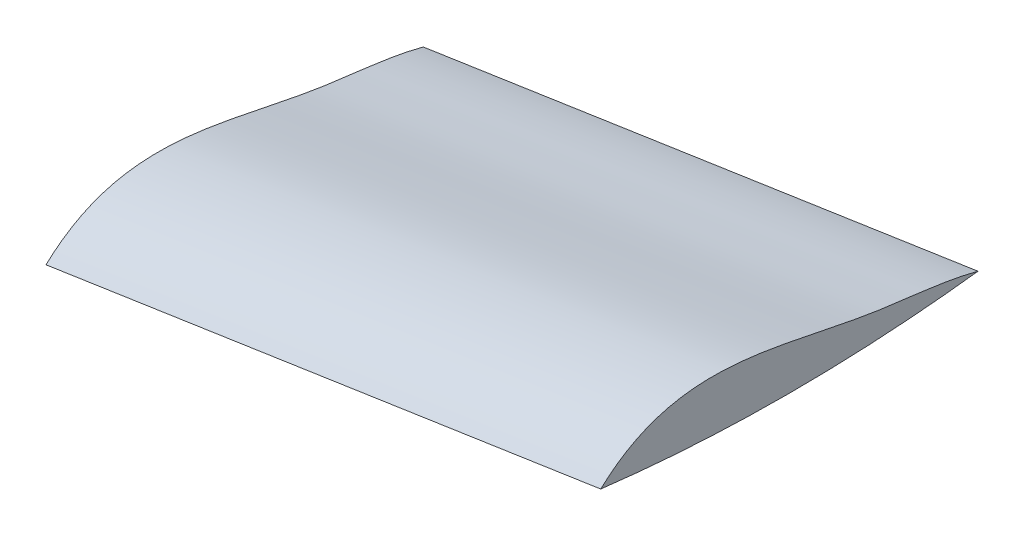
ISO-10303-21;
HEADER;
FILE_DESCRIPTION(('STEP AP214'),'2;1');
FILE_NAME('part.step','',(''),(''),'','','');
FILE_SCHEMA(('AUTOMOTIVE_DESIGN { 1 0 10303 214 1 1 1 1 }'));
ENDSEC;
DATA;
#1=APPLICATION_CONTEXT('core data for automotive mechanical design processes');
#2=APPLICATION_PROTOCOL_DEFINITION('international standard','automotive_design',2000,#1);
#3=PRODUCT_CONTEXT('',#1,'mechanical');
#4=PRODUCT('Part','Part','',(#3));
#5=PRODUCT_RELATED_PRODUCT_CATEGORY('part','',(#4));
#6=PRODUCT_DEFINITION_FORMATION('','',#4);
#7=PRODUCT_DEFINITION_CONTEXT('part definition',#1,'design');
#8=PRODUCT_DEFINITION('design','',#6,#7);
#9=PRODUCT_DEFINITION_SHAPE('','',#8);
#10=(LENGTH_UNIT() NAMED_UNIT(*) SI_UNIT(.MILLI.,.METRE.));
#11=(NAMED_UNIT(*) PLANE_ANGLE_UNIT() SI_UNIT($,.RADIAN.));
#12=(NAMED_UNIT(*) SI_UNIT($,.STERADIAN.) SOLID_ANGLE_UNIT());
#13=UNCERTAINTY_MEASURE_WITH_UNIT(LENGTH_MEASURE(1.E-05),#10,'distance_accuracy_value','');
#14=(GEOMETRIC_REPRESENTATION_CONTEXT(3) GLOBAL_UNCERTAINTY_ASSIGNED_CONTEXT((#13)) GLOBAL_UNIT_ASSIGNED_CONTEXT((#10,
#11,#12)) REPRESENTATION_CONTEXT('',''));
#15=CARTESIAN_POINT('',(0.,0.,0.));
#16=DIRECTION('',(0.,0.,1.));
#17=DIRECTION('',(1.,0.,0.));
#18=AXIS2_PLACEMENT_3D('',#15,#16,#17);
#19=CARTESIAN_POINT('',(0.,-19.000759592895,-209.861011224746));
#20=DIRECTION('',(-1.,0.,0.));
#21=DIRECTION('',(0.,0.,1.));
#22=AXIS2_PLACEMENT_3D('',#19,#20,#21);
#23=PLANE('',#22);
#24=CARTESIAN_POINT('',(0.,-3.6750964557679,43.7009764592046));
#25=CARTESIAN_POINT('',(0.,-34.326422730022,-209.422998908696));
#26=CARTESIAN_POINT('',(0.,-3.6750964557679,-464.299023540795));
#27=B_SPLINE_CURVE_WITH_KNOTS('',2,(#24,#25,#26),.UNSPECIFIED.,.F.,.F.,(3,3),(0.,1.),.UNSPECIFIED.);
#28=CARTESIAN_POINT('',(0.,-3.6750964557679,43.7009764592046));
#29=VERTEX_POINT('',#28);
#30=CARTESIAN_POINT('',(0.,-3.6750964557679,-464.299023540795));
#31=VERTEX_POINT('',#30);
#32=EDGE_CURVE('E60',#29,#31,#27,.T.);
#33=ORIENTED_EDGE('',*,*,#32,.T.);
#34=CARTESIAN_POINT('',(0.,-3.6750964557679,-464.299023540795));
#35=CARTESIAN_POINT('',(0.,8.74078390062267,-417.69942723074));
#36=CARTESIAN_POINT('',(0.,18.2596920768661,-246.664616315625));
#37=CARTESIAN_POINT('',(0.,93.5576710370726,-60.093960524119));
#38=CARTESIAN_POINT('',(0.,-3.6750964557679,43.7009764592046));
#39=B_SPLINE_CURVE_WITH_KNOTS('',3,(#34,#35,#36,#37,#38),.UNSPECIFIED.,.F.,.F.,(4,1,4),(0.,
0.273223185439462,1.),.UNSPECIFIED.);
#40=EDGE_CURVE('E65',#31,#29,#39,.T.);
#41=ORIENTED_EDGE('',*,*,#40,.T.);
#42=EDGE_LOOP('',(#33,#41));
#43=FACE_BOUND('',#42,.T.);
#44=ADVANCED_FACE('F32',(#43),#23,.F.);
#45=CARTESIAN_POINT('',(-635.,-19.000759592895,-97.8933784748722));
#46=DIRECTION('',(-1.,0.,0.));
#47=DIRECTION('',(0.,0.,1.));
#48=AXIS2_PLACEMENT_3D('',#45,#46,#47);
#49=PLANE('',#48);
#50=CARTESIAN_POINT('',(-635.,-3.6750964557679,155.668609209078));
#51=CARTESIAN_POINT('',(-635.,-34.326422730022,-97.4553661588223));
#52=CARTESIAN_POINT('',(-635.,-3.6750964557679,-352.331390790922));
#53=B_SPLINE_CURVE_WITH_KNOTS('',2,(#50,#51,#52),.UNSPECIFIED.,.F.,.F.,(3,3),(0.,1.),.UNSPECIFIED.);
#54=CARTESIAN_POINT('',(-635.,-3.6750964557679,155.668609209078));
#55=VERTEX_POINT('',#54);
#56=CARTESIAN_POINT('',(-635.,-3.6750964557679,-352.331390790922));
#57=VERTEX_POINT('',#56);
#58=EDGE_CURVE('E48',#55,#57,#53,.T.);
#59=ORIENTED_EDGE('',*,*,#58,.F.);
#60=CARTESIAN_POINT('',(-635.,-3.6750964557679,-352.331390790922));
#61=CARTESIAN_POINT('',(-635.,8.74078390062267,-305.731794480866));
#62=CARTESIAN_POINT('',(-635.,18.2596920768661,-134.696983565751));
#63=CARTESIAN_POINT('',(-635.,93.5576710370726,51.8736722257543));
#64=CARTESIAN_POINT('',(-635.,-3.6750964557679,155.668609209078));
#65=B_SPLINE_CURVE_WITH_KNOTS('',3,(#60,#61,#62,#63,#64),.UNSPECIFIED.,.F.,.F.,(4,1,4),(0.,
0.273223185439462,1.),.UNSPECIFIED.);
#66=EDGE_CURVE('E11',#57,#55,#65,.T.);
#67=ORIENTED_EDGE('',*,*,#66,.F.);
#68=EDGE_LOOP('',(#59,#67));
#69=FACE_BOUND('',#68,.T.);
#70=ADVANCED_FACE('F91',(#69),#49,.T.);
#71=CARTESIAN_POINT('',(0.,-3.6750964557679,43.7009764592046));
#72=CARTESIAN_POINT('',(-635.,-3.6750964557679,155.668609209078));
#73=CARTESIAN_POINT('',(0.,-34.326422730022,-209.422998908696));
#74=CARTESIAN_POINT('',(-635.,-34.326422730022,-97.4553661588223));
#75=CARTESIAN_POINT('',(0.,-3.6750964557679,-464.299023540795));
#76=CARTESIAN_POINT('',(-635.,-3.6750964557679,-352.331390790922));
#77=B_SPLINE_SURFACE_WITH_KNOTS('',2,1,((#71,#72),(#73,#74),(#75,#76)),.UNSPECIFIED.,.F.,.F.,
.F.,(3,3),(2,2),(0.,1.),(0.,1.),.UNSPECIFIED.);
#78=DIRECTION('',(-0.984807753012209,0.,0.173648177666927));
#79=VECTOR('',#78,1.);
#80=CARTESIAN_POINT('',(0.,-3.6750964557679,-464.299023540795));
#81=LINE('',#80,#79);
#82=EDGE_CURVE('E41',#31,#57,#81,.T.);
#83=DIRECTION('',(-0.984807753012209,0.,0.173648177666927));
#84=VECTOR('',#83,1.);
#85=CARTESIAN_POINT('',(0.,-3.6750964557679,43.7009764592046));
#86=LINE('',#85,#84);
#87=EDGE_CURVE('E63',#29,#55,#86,.T.);
#88=ORIENTED_EDGE('',*,*,#82,.F.);
#89=ORIENTED_EDGE('',*,*,#32,.F.);
#90=ORIENTED_EDGE('',*,*,#87,.T.);
#91=ORIENTED_EDGE('',*,*,#58,.T.);
#92=EDGE_LOOP('',(#88,#89,#90,#91));
#93=FACE_BOUND('',#92,.T.);
#94=ADVANCED_FACE('F62',(#93),#77,.F.);
#95=CARTESIAN_POINT('',(0.,-3.6750964557679,-464.299023540795));
#96=CARTESIAN_POINT('',(-635.,-3.6750964557679,-352.331390790922));
#97=CARTESIAN_POINT('',(0.,8.74078390062267,-417.69942723074));
#98=CARTESIAN_POINT('',(-635.,8.74078390062267,-305.731794480866));
#99=CARTESIAN_POINT('',(0.,18.2596920768661,-246.664616315625));
#100=CARTESIAN_POINT('',(-635.,18.2596920768661,-134.696983565751));
#101=CARTESIAN_POINT('',(0.,93.5576710370726,-60.093960524119));
#102=CARTESIAN_POINT('',(-635.,93.5576710370726,51.8736722257543));
#103=CARTESIAN_POINT('',(0.,-3.6750964557679,43.7009764592046));
#104=CARTESIAN_POINT('',(-635.,-3.6750964557679,155.668609209078));
#105=B_SPLINE_SURFACE_WITH_KNOTS('',3,1,((#95,#96),(#97,#98),(#99,#100),(#101,#102),(#103,
#104)),.UNSPECIFIED.,.F.,.F.,.F.,(4,1,4),(2,2),(0.,0.273223185439462,1.),(0.,1.),.UNSPECIFIED.);
#106=ORIENTED_EDGE('',*,*,#66,.T.);
#107=ORIENTED_EDGE('',*,*,#87,.F.);
#108=ORIENTED_EDGE('',*,*,#40,.F.);
#109=ORIENTED_EDGE('',*,*,#82,.T.);
#110=EDGE_LOOP('',(#106,#107,#108,#109));
#111=FACE_BOUND('',#110,.T.);
#112=ADVANCED_FACE('F67',(#111),#105,.F.);
#113=CLOSED_SHELL('',(#44,#70,#94,#112));
#114=MANIFOLD_SOLID_BREP('B2',#113);
#115=ADVANCED_BREP_SHAPE_REPRESENTATION('',(#18,#114),#14);
#116=SHAPE_DEFINITION_REPRESENTATION(#9,#115);
ENDSEC;
END-ISO-10303-21;
